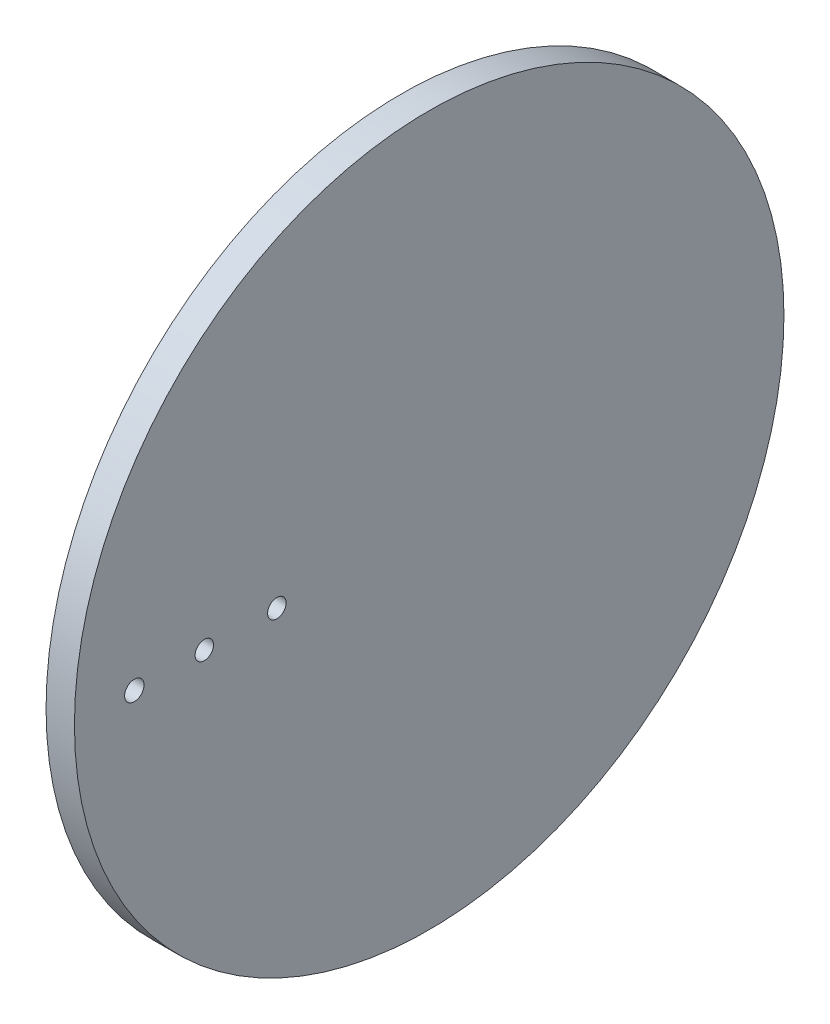
ISO-10303-21;
HEADER;
FILE_DESCRIPTION(('STEP AP214'),'2;1');
FILE_NAME('part.step','',(''),(''),'','','');
FILE_SCHEMA(('AUTOMOTIVE_DESIGN { 1 0 10303 214 1 1 1 1 }'));
ENDSEC;
DATA;
#1=APPLICATION_CONTEXT('core data for automotive mechanical design processes');
#2=APPLICATION_PROTOCOL_DEFINITION('international standard','automotive_design',2000,#1);
#3=PRODUCT_CONTEXT('',#1,'mechanical');
#4=PRODUCT('Part','Part','',(#3));
#5=PRODUCT_RELATED_PRODUCT_CATEGORY('part','',(#4));
#6=PRODUCT_DEFINITION_FORMATION('','',#4);
#7=PRODUCT_DEFINITION_CONTEXT('part definition',#1,'design');
#8=PRODUCT_DEFINITION('design','',#6,#7);
#9=PRODUCT_DEFINITION_SHAPE('','',#8);
#10=(LENGTH_UNIT() NAMED_UNIT(*) SI_UNIT(.MILLI.,.METRE.));
#11=(NAMED_UNIT(*) PLANE_ANGLE_UNIT() SI_UNIT($,.RADIAN.));
#12=(NAMED_UNIT(*) SI_UNIT($,.STERADIAN.) SOLID_ANGLE_UNIT());
#13=UNCERTAINTY_MEASURE_WITH_UNIT(LENGTH_MEASURE(1.E-05),#10,'distance_accuracy_value','');
#14=(GEOMETRIC_REPRESENTATION_CONTEXT(3) GLOBAL_UNCERTAINTY_ASSIGNED_CONTEXT((#13)) GLOBAL_UNIT_ASSIGNED_CONTEXT((#10,
#11,#12)) REPRESENTATION_CONTEXT('',''));
#15=CARTESIAN_POINT('',(0.,0.,0.));
#16=DIRECTION('',(0.,0.,1.));
#17=DIRECTION('',(1.,0.,0.));
#18=AXIS2_PLACEMENT_3D('',#15,#16,#17);
#19=CARTESIAN_POINT('',(3.,0.,0.));
#20=DIRECTION('',(-1.,0.,0.));
#21=DIRECTION('',(0.,0.,1.));
#22=AXIS2_PLACEMENT_3D('',#19,#20,#21);
#23=CYLINDRICAL_SURFACE('',#22,37.5);
#24=CARTESIAN_POINT('',(3.,0.,0.));
#25=DIRECTION('',(1.,0.,0.));
#26=DIRECTION('',(0.,0.,-1.));
#27=AXIS2_PLACEMENT_3D('',#24,#25,#26);
#28=CIRCLE('',#27,37.5);
#29=CARTESIAN_POINT('',(3.,0.,-37.5));
#30=VERTEX_POINT('',#29);
#31=EDGE_CURVE('E11',#30,#30,#28,.T.);
#32=ORIENTED_EDGE('',*,*,#31,.F.);
#33=EDGE_LOOP('',(#32));
#34=FACE_BOUND('',#33,.T.);
#35=CARTESIAN_POINT('',(0.,0.,0.));
#36=DIRECTION('',(1.,0.,0.));
#37=DIRECTION('',(0.,0.,-1.));
#38=AXIS2_PLACEMENT_3D('',#35,#36,#37);
#39=CIRCLE('',#38,37.5);
#40=CARTESIAN_POINT('',(0.,0.,-37.5));
#41=VERTEX_POINT('',#40);
#42=EDGE_CURVE('E61',#41,#41,#39,.T.);
#43=ORIENTED_EDGE('',*,*,#42,.T.);
#44=EDGE_LOOP('',(#43));
#45=FACE_BOUND('',#44,.T.);
#46=ADVANCED_FACE('F54',(#34,#45),#23,.T.);
#47=CARTESIAN_POINT('',(3.,0.,0.));
#48=DIRECTION('',(1.,0.,0.));
#49=DIRECTION('',(0.,0.,-1.));
#50=AXIS2_PLACEMENT_3D('',#47,#48,#49);
#51=PLANE('',#50);
#52=CARTESIAN_POINT('',(3.,0.,16.1016841919922));
#53=DIRECTION('',(-1.,0.,0.));
#54=DIRECTION('',(0.,0.,1.));
#55=AXIS2_PLACEMENT_3D('',#52,#53,#54);
#56=CIRCLE('',#55,0.976738778849215);
#57=CARTESIAN_POINT('',(3.,0.,17.0784229708414));
#58=VERTEX_POINT('',#57);
#59=EDGE_CURVE('E75',#58,#58,#56,.T.);
#60=ORIENTED_EDGE('',*,*,#59,.T.);
#61=EDGE_LOOP('',(#60));
#62=FACE_BOUND('',#61,.T.);
#63=CARTESIAN_POINT('',(3.,0.,23.7689987059089));
#64=DIRECTION('',(-1.,0.,0.));
#65=DIRECTION('',(0.,0.,1.));
#66=AXIS2_PLACEMENT_3D('',#63,#64,#65);
#67=CIRCLE('',#66,0.973277504891765);
#68=CARTESIAN_POINT('',(3.,0.,24.7422762108007));
#69=VERTEX_POINT('',#68);
#70=EDGE_CURVE('E192',#69,#69,#67,.T.);
#71=ORIENTED_EDGE('',*,*,#70,.T.);
#72=EDGE_LOOP('',(#71));
#73=FACE_BOUND('',#72,.T.);
#74=CARTESIAN_POINT('',(3.,0.,31.1682252997586));
#75=DIRECTION('',(-1.,0.,0.));
#76=DIRECTION('',(0.,0.,1.));
#77=AXIS2_PLACEMENT_3D('',#74,#75,#76);
#78=CIRCLE('',#77,1.02689508890517);
#79=CARTESIAN_POINT('',(3.,0.,32.1951203886638));
#80=VERTEX_POINT('',#79);
#81=EDGE_CURVE('E195',#80,#80,#78,.T.);
#82=ORIENTED_EDGE('',*,*,#81,.T.);
#83=EDGE_LOOP('',(#82));
#84=FACE_BOUND('',#83,.T.);
#85=ORIENTED_EDGE('',*,*,#31,.T.);
#86=EDGE_LOOP('',(#85));
#87=FACE_BOUND('',#86,.T.);
#88=ADVANCED_FACE('F124',(#62,#73,#84,#87),#51,.T.);
#89=CARTESIAN_POINT('',(0.,0.,0.));
#90=DIRECTION('',(1.,0.,0.));
#91=DIRECTION('',(0.,0.,-1.));
#92=AXIS2_PLACEMENT_3D('',#89,#90,#91);
#93=PLANE('',#92);
#94=CARTESIAN_POINT('',(0.,0.,0.));
#95=DIRECTION('',(-1.,0.,0.));
#96=DIRECTION('',(0.,0.,1.));
#97=AXIS2_PLACEMENT_3D('',#94,#95,#96);
#98=CIRCLE('',#97,32.4822305749851);
#99=CARTESIAN_POINT('',(0.,0.,32.4822305749851));
#100=VERTEX_POINT('',#99);
#101=EDGE_CURVE('E69',#100,#100,#98,.T.);
#102=ORIENTED_EDGE('',*,*,#101,.F.);
#103=EDGE_LOOP('',(#102));
#104=FACE_BOUND('',#103,.T.);
#105=ORIENTED_EDGE('',*,*,#42,.F.);
#106=EDGE_LOOP('',(#105));
#107=FACE_BOUND('',#106,.T.);
#108=ADVANCED_FACE('F120',(#104,#107),#93,.F.);
#109=CARTESIAN_POINT('',(1.,0.,0.));
#110=DIRECTION('',(-1.,0.,0.));
#111=DIRECTION('',(0.,0.,1.));
#112=AXIS2_PLACEMENT_3D('',#109,#110,#111);
#113=CYLINDRICAL_SURFACE('',#112,29.9595020211755);
#114=CARTESIAN_POINT('',(1.,0.,0.));
#115=DIRECTION('',(-1.,0.,0.));
#116=DIRECTION('',(0.,0.,1.));
#117=AXIS2_PLACEMENT_3D('',#114,#115,#116);
#118=CIRCLE('',#117,29.9595020211755);
#119=CARTESIAN_POINT('',(1.,0.,29.9595020211755));
#120=VERTEX_POINT('',#119);
#121=EDGE_CURVE('E108',#120,#120,#118,.T.);
#122=ORIENTED_EDGE('',*,*,#121,.T.);
#123=EDGE_LOOP('',(#122));
#124=FACE_BOUND('',#123,.T.);
#125=CARTESIAN_POINT('',(0.,0.,0.));
#126=DIRECTION('',(-1.,0.,0.));
#127=DIRECTION('',(0.,0.,1.));
#128=AXIS2_PLACEMENT_3D('',#125,#126,#127);
#129=CIRCLE('',#128,29.9595020211755);
#130=CARTESIAN_POINT('',(0.,0.,29.9595020211755));
#131=VERTEX_POINT('',#130);
#132=EDGE_CURVE('E102',#131,#131,#129,.T.);
#133=ORIENTED_EDGE('',*,*,#132,.F.);
#134=EDGE_LOOP('',(#133));
#135=FACE_BOUND('',#134,.T.);
#136=ADVANCED_FACE('F123',(#124,#135),#113,.T.);
#137=CARTESIAN_POINT('',(1.,0.,0.));
#138=DIRECTION('',(-1.,0.,0.));
#139=DIRECTION('',(0.,0.,1.));
#140=AXIS2_PLACEMENT_3D('',#137,#138,#139);
#141=CYLINDRICAL_SURFACE('',#140,32.4822305749851);
#142=CARTESIAN_POINT('',(1.,0.,0.));
#143=DIRECTION('',(-1.,0.,0.));
#144=DIRECTION('',(0.,0.,1.));
#145=AXIS2_PLACEMENT_3D('',#142,#143,#144);
#146=CIRCLE('',#145,32.4822305749851);
#147=CARTESIAN_POINT('',(1.,0.,32.4822305749851));
#148=VERTEX_POINT('',#147);
#149=EDGE_CURVE('E66',#148,#148,#146,.T.);
#150=ORIENTED_EDGE('',*,*,#149,.F.);
#151=EDGE_LOOP('',(#150));
#152=FACE_BOUND('',#151,.T.);
#153=ORIENTED_EDGE('',*,*,#101,.T.);
#154=EDGE_LOOP('',(#153));
#155=FACE_BOUND('',#154,.T.);
#156=ADVANCED_FACE('F118',(#152,#155),#141,.F.);
#157=CARTESIAN_POINT('',(1.,0.,0.));
#158=DIRECTION('',(-1.,0.,0.));
#159=DIRECTION('',(0.,0.,1.));
#160=AXIS2_PLACEMENT_3D('',#157,#158,#159);
#161=PLANE('',#160);
#162=CARTESIAN_POINT('',(1.,0.,31.1682252997586));
#163=DIRECTION('',(-1.,0.,0.));
#164=DIRECTION('',(0.,0.,1.));
#165=AXIS2_PLACEMENT_3D('',#162,#163,#164);
#166=CIRCLE('',#165,1.02689508890517);
#167=CARTESIAN_POINT('',(1.,0.,32.1951203886638));
#168=VERTEX_POINT('',#167);
#169=EDGE_CURVE('E57',#168,#168,#166,.T.);
#170=ORIENTED_EDGE('',*,*,#169,.F.);
#171=EDGE_LOOP('',(#170));
#172=FACE_BOUND('',#171,.T.);
#173=ORIENTED_EDGE('',*,*,#121,.F.);
#174=EDGE_LOOP('',(#173));
#175=FACE_BOUND('',#174,.T.);
#176=ORIENTED_EDGE('',*,*,#149,.T.);
#177=EDGE_LOOP('',(#176));
#178=FACE_BOUND('',#177,.T.);
#179=ADVANCED_FACE('F148',(#172,#175,#178),#161,.T.);
#180=CARTESIAN_POINT('',(0.,0.,0.));
#181=DIRECTION('',(-1.,0.,0.));
#182=DIRECTION('',(0.,0.,1.));
#183=AXIS2_PLACEMENT_3D('',#180,#181,#182);
#184=CIRCLE('',#183,24.9972706293364);
#185=CARTESIAN_POINT('',(0.,0.,24.9972706293364));
#186=VERTEX_POINT('',#185);
#187=EDGE_CURVE('E99',#186,#186,#184,.T.);
#188=ORIENTED_EDGE('',*,*,#187,.F.);
#189=EDGE_LOOP('',(#188));
#190=FACE_BOUND('',#189,.T.);
#191=ORIENTED_EDGE('',*,*,#132,.T.);
#192=EDGE_LOOP('',(#191));
#193=FACE_BOUND('',#192,.T.);
#194=ADVANCED_FACE('F126',(#190,#193),#93,.F.);
#195=CARTESIAN_POINT('',(1.,0.,0.));
#196=DIRECTION('',(-1.,0.,0.));
#197=DIRECTION('',(0.,0.,1.));
#198=AXIS2_PLACEMENT_3D('',#195,#196,#197);
#199=CYLINDRICAL_SURFACE('',#198,22.4955701608359);
#200=CARTESIAN_POINT('',(1.,0.,0.));
#201=DIRECTION('',(-1.,0.,0.));
#202=DIRECTION('',(0.,0.,1.));
#203=AXIS2_PLACEMENT_3D('',#200,#201,#202);
#204=CIRCLE('',#203,22.4955701608359);
#205=CARTESIAN_POINT('',(1.,0.,22.4955701608359));
#206=VERTEX_POINT('',#205);
#207=EDGE_CURVE('E95',#206,#206,#204,.T.);
#208=ORIENTED_EDGE('',*,*,#207,.T.);
#209=EDGE_LOOP('',(#208));
#210=FACE_BOUND('',#209,.T.);
#211=CARTESIAN_POINT('',(0.,0.,0.));
#212=DIRECTION('',(-1.,0.,0.));
#213=DIRECTION('',(0.,0.,1.));
#214=AXIS2_PLACEMENT_3D('',#211,#212,#213);
#215=CIRCLE('',#214,22.4955701608359);
#216=CARTESIAN_POINT('',(0.,0.,22.4955701608359));
#217=VERTEX_POINT('',#216);
#218=EDGE_CURVE('E103',#217,#217,#215,.T.);
#219=ORIENTED_EDGE('',*,*,#218,.F.);
#220=EDGE_LOOP('',(#219));
#221=FACE_BOUND('',#220,.T.);
#222=ADVANCED_FACE('F152',(#210,#221),#199,.T.);
#223=CARTESIAN_POINT('',(1.,0.,0.));
#224=DIRECTION('',(-1.,0.,0.));
#225=DIRECTION('',(0.,0.,1.));
#226=AXIS2_PLACEMENT_3D('',#223,#224,#225);
#227=CYLINDRICAL_SURFACE('',#226,24.9972706293364);
#228=CARTESIAN_POINT('',(1.,0.,0.));
#229=DIRECTION('',(-1.,0.,0.));
#230=DIRECTION('',(0.,0.,1.));
#231=AXIS2_PLACEMENT_3D('',#228,#229,#230);
#232=CIRCLE('',#231,24.9972706293364);
#233=CARTESIAN_POINT('',(1.,0.,24.9972706293364));
#234=VERTEX_POINT('',#233);
#235=EDGE_CURVE('E98',#234,#234,#232,.T.);
#236=ORIENTED_EDGE('',*,*,#235,.F.);
#237=EDGE_LOOP('',(#236));
#238=FACE_BOUND('',#237,.T.);
#239=ORIENTED_EDGE('',*,*,#187,.T.);
#240=EDGE_LOOP('',(#239));
#241=FACE_BOUND('',#240,.T.);
#242=ADVANCED_FACE('F155',(#238,#241),#227,.F.);
#243=CARTESIAN_POINT('',(1.,0.,0.));
#244=DIRECTION('',(-1.,0.,0.));
#245=DIRECTION('',(0.,0.,1.));
#246=AXIS2_PLACEMENT_3D('',#243,#244,#245);
#247=PLANE('',#246);
#248=CARTESIAN_POINT('',(1.,0.,23.7689987059089));
#249=DIRECTION('',(-1.,0.,0.));
#250=DIRECTION('',(0.,0.,1.));
#251=AXIS2_PLACEMENT_3D('',#248,#249,#250);
#252=CIRCLE('',#251,0.973277504891765);
#253=CARTESIAN_POINT('',(1.,0.,24.7422762108007));
#254=VERTEX_POINT('',#253);
#255=EDGE_CURVE('E74',#254,#254,#252,.T.);
#256=ORIENTED_EDGE('',*,*,#255,.F.);
#257=EDGE_LOOP('',(#256));
#258=FACE_BOUND('',#257,.T.);
#259=ORIENTED_EDGE('',*,*,#207,.F.);
#260=EDGE_LOOP('',(#259));
#261=FACE_BOUND('',#260,.T.);
#262=ORIENTED_EDGE('',*,*,#235,.T.);
#263=EDGE_LOOP('',(#262));
#264=FACE_BOUND('',#263,.T.);
#265=ADVANCED_FACE('F159',(#258,#261,#264),#247,.T.);
#266=CARTESIAN_POINT('',(0.,0.,0.));
#267=DIRECTION('',(-1.,0.,0.));
#268=DIRECTION('',(0.,0.,1.));
#269=AXIS2_PLACEMENT_3D('',#266,#267,#268);
#270=CIRCLE('',#269,17.4679722470061);
#271=CARTESIAN_POINT('',(0.,0.,17.4679722470061));
#272=VERTEX_POINT('',#271);
#273=EDGE_CURVE('E84',#272,#272,#270,.T.);
#274=ORIENTED_EDGE('',*,*,#273,.F.);
#275=EDGE_LOOP('',(#274));
#276=FACE_BOUND('',#275,.T.);
#277=ORIENTED_EDGE('',*,*,#218,.T.);
#278=EDGE_LOOP('',(#277));
#279=FACE_BOUND('',#278,.T.);
#280=ADVANCED_FACE('F125',(#276,#279),#93,.F.);
#281=CARTESIAN_POINT('',(1.,0.,0.));
#282=DIRECTION('',(-1.,0.,0.));
#283=DIRECTION('',(0.,0.,1.));
#284=AXIS2_PLACEMENT_3D('',#281,#282,#283);
#285=CYLINDRICAL_SURFACE('',#284,14.9582061195627);
#286=CARTESIAN_POINT('',(1.,0.,0.));
#287=DIRECTION('',(-1.,0.,0.));
#288=DIRECTION('',(0.,0.,1.));
#289=AXIS2_PLACEMENT_3D('',#286,#287,#288);
#290=CIRCLE('',#289,14.9582061195627);
#291=CARTESIAN_POINT('',(1.,0.,14.9582061195627));
#292=VERTEX_POINT('',#291);
#293=EDGE_CURVE('E89',#292,#292,#290,.T.);
#294=ORIENTED_EDGE('',*,*,#293,.T.);
#295=EDGE_LOOP('',(#294));
#296=FACE_BOUND('',#295,.T.);
#297=CARTESIAN_POINT('',(0.,0.,0.));
#298=DIRECTION('',(-1.,0.,0.));
#299=DIRECTION('',(0.,0.,1.));
#300=AXIS2_PLACEMENT_3D('',#297,#298,#299);
#301=CIRCLE('',#300,14.9582061195627);
#302=CARTESIAN_POINT('',(0.,0.,14.9582061195627));
#303=VERTEX_POINT('',#302);
#304=EDGE_CURVE('E80',#303,#303,#301,.T.);
#305=ORIENTED_EDGE('',*,*,#304,.F.);
#306=EDGE_LOOP('',(#305));
#307=FACE_BOUND('',#306,.T.);
#308=ADVANCED_FACE('F164',(#296,#307),#285,.T.);
#309=CARTESIAN_POINT('',(1.,0.,0.));
#310=DIRECTION('',(-1.,0.,0.));
#311=DIRECTION('',(0.,0.,1.));
#312=AXIS2_PLACEMENT_3D('',#309,#310,#311);
#313=CYLINDRICAL_SURFACE('',#312,17.4679722470061);
#314=CARTESIAN_POINT('',(1.,0.,0.));
#315=DIRECTION('',(-1.,0.,0.));
#316=DIRECTION('',(0.,0.,1.));
#317=AXIS2_PLACEMENT_3D('',#314,#315,#316);
#318=CIRCLE('',#317,17.4679722470061);
#319=CARTESIAN_POINT('',(1.,0.,17.4679722470061));
#320=VERTEX_POINT('',#319);
#321=EDGE_CURVE('E92',#320,#320,#318,.T.);
#322=ORIENTED_EDGE('',*,*,#321,.F.);
#323=EDGE_LOOP('',(#322));
#324=FACE_BOUND('',#323,.T.);
#325=ORIENTED_EDGE('',*,*,#273,.T.);
#326=EDGE_LOOP('',(#325));
#327=FACE_BOUND('',#326,.T.);
#328=ADVANCED_FACE('F167',(#324,#327),#313,.F.);
#329=CARTESIAN_POINT('',(1.,0.,0.));
#330=DIRECTION('',(-1.,0.,0.));
#331=DIRECTION('',(0.,0.,1.));
#332=AXIS2_PLACEMENT_3D('',#329,#330,#331);
#333=PLANE('',#332);
#334=CARTESIAN_POINT('',(1.,0.,16.1016841919922));
#335=DIRECTION('',(-1.,0.,0.));
#336=DIRECTION('',(0.,0.,1.));
#337=AXIS2_PLACEMENT_3D('',#334,#335,#336);
#338=CIRCLE('',#337,0.976738778849215);
#339=CARTESIAN_POINT('',(1.,0.,17.0784229708414));
#340=VERTEX_POINT('',#339);
#341=EDGE_CURVE('E72',#340,#340,#338,.T.);
#342=ORIENTED_EDGE('',*,*,#341,.F.);
#343=EDGE_LOOP('',(#342));
#344=FACE_BOUND('',#343,.T.);
#345=ORIENTED_EDGE('',*,*,#293,.F.);
#346=EDGE_LOOP('',(#345));
#347=FACE_BOUND('',#346,.T.);
#348=ORIENTED_EDGE('',*,*,#321,.T.);
#349=EDGE_LOOP('',(#348));
#350=FACE_BOUND('',#349,.T.);
#351=ADVANCED_FACE('F171',(#344,#347,#350),#333,.T.);
#352=ORIENTED_EDGE('',*,*,#304,.T.);
#353=EDGE_LOOP('',(#352));
#354=FACE_BOUND('',#353,.T.);
#355=ADVANCED_FACE('F175',(#354),#93,.F.);
#356=CARTESIAN_POINT('',(3.,0.,16.1016841919922));
#357=DIRECTION('',(-1.,0.,0.));
#358=DIRECTION('',(0.,0.,1.));
#359=AXIS2_PLACEMENT_3D('',#356,#357,#358);
#360=CYLINDRICAL_SURFACE('',#359,0.976738778849215);
#361=ORIENTED_EDGE('',*,*,#341,.T.);
#362=EDGE_LOOP('',(#361));
#363=FACE_BOUND('',#362,.T.);
#364=ORIENTED_EDGE('',*,*,#59,.F.);
#365=EDGE_LOOP('',(#364));
#366=FACE_BOUND('',#365,.T.);
#367=ADVANCED_FACE('F183',(#363,#366),#360,.F.);
#368=CARTESIAN_POINT('',(3.,0.,23.7689987059089));
#369=DIRECTION('',(-1.,0.,0.));
#370=DIRECTION('',(0.,0.,1.));
#371=AXIS2_PLACEMENT_3D('',#368,#369,#370);
#372=CYLINDRICAL_SURFACE('',#371,0.973277504891765);
#373=ORIENTED_EDGE('',*,*,#255,.T.);
#374=EDGE_LOOP('',(#373));
#375=FACE_BOUND('',#374,.T.);
#376=ORIENTED_EDGE('',*,*,#70,.F.);
#377=EDGE_LOOP('',(#376));
#378=FACE_BOUND('',#377,.T.);
#379=ADVANCED_FACE('F180',(#375,#378),#372,.F.);
#380=CARTESIAN_POINT('',(3.,0.,31.1682252997586));
#381=DIRECTION('',(-1.,0.,0.));
#382=DIRECTION('',(0.,0.,1.));
#383=AXIS2_PLACEMENT_3D('',#380,#381,#382);
#384=CYLINDRICAL_SURFACE('',#383,1.02689508890517);
#385=ORIENTED_EDGE('',*,*,#169,.T.);
#386=EDGE_LOOP('',(#385));
#387=FACE_BOUND('',#386,.T.);
#388=ORIENTED_EDGE('',*,*,#81,.F.);
#389=EDGE_LOOP('',(#388));
#390=FACE_BOUND('',#389,.T.);
#391=ADVANCED_FACE('F177',(#387,#390),#384,.F.);
#392=CLOSED_SHELL('',(#46,#88,#108,#136,#156,#179,#194,#222,#242,#265,#280,#308,#328,#351,#355,
#367,#379,#391));
#393=MANIFOLD_SOLID_BREP('B2',#392);
#394=ADVANCED_BREP_SHAPE_REPRESENTATION('',(#18,#393),#14);
#395=SHAPE_DEFINITION_REPRESENTATION(#9,#394);
ENDSEC;
END-ISO-10303-21;
